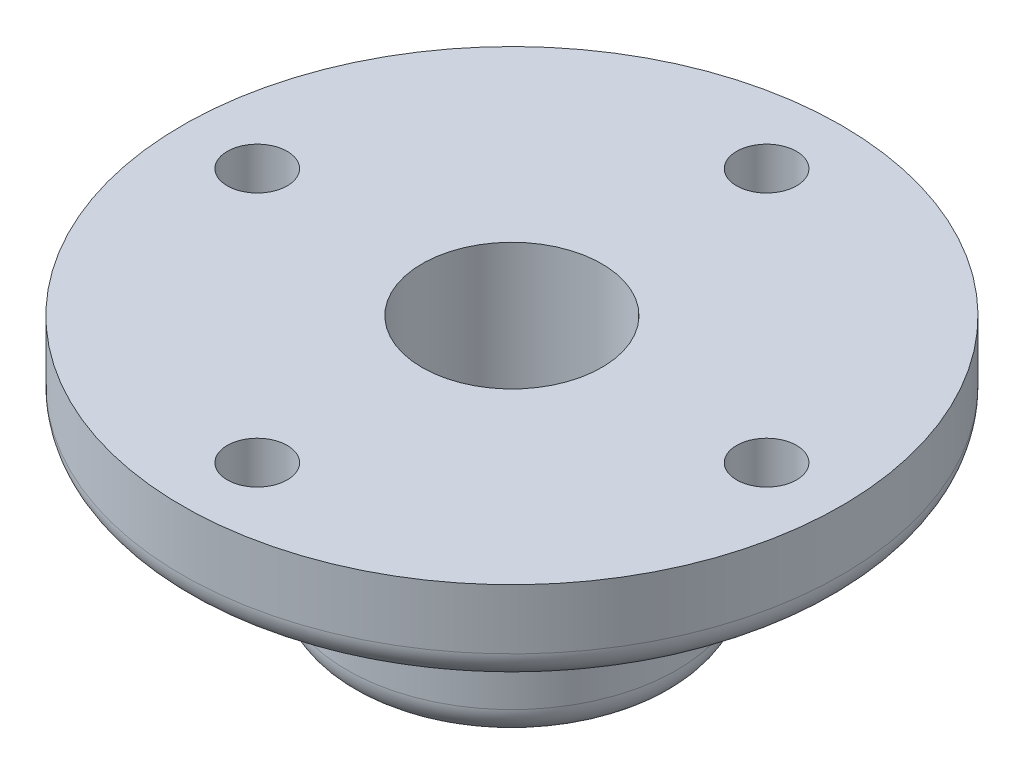
ISO-10303-21;
HEADER;
FILE_DESCRIPTION(('STEP AP214'),'2;1');
FILE_NAME('part.step','',(''),(''),'','','');
FILE_SCHEMA(('AUTOMOTIVE_DESIGN { 1 0 10303 214 1 1 1 1 }'));
ENDSEC;
DATA;
#1=APPLICATION_CONTEXT('core data for automotive mechanical design processes');
#2=APPLICATION_PROTOCOL_DEFINITION('international standard','automotive_design',2000,#1);
#3=PRODUCT_CONTEXT('',#1,'mechanical');
#4=PRODUCT('Part','Part','',(#3));
#5=PRODUCT_RELATED_PRODUCT_CATEGORY('part','',(#4));
#6=PRODUCT_DEFINITION_FORMATION('','',#4);
#7=PRODUCT_DEFINITION_CONTEXT('part definition',#1,'design');
#8=PRODUCT_DEFINITION('design','',#6,#7);
#9=PRODUCT_DEFINITION_SHAPE('','',#8);
#10=(LENGTH_UNIT() NAMED_UNIT(*) SI_UNIT(.MILLI.,.METRE.));
#11=(NAMED_UNIT(*) PLANE_ANGLE_UNIT() SI_UNIT($,.RADIAN.));
#12=(NAMED_UNIT(*) SI_UNIT($,.STERADIAN.) SOLID_ANGLE_UNIT());
#13=UNCERTAINTY_MEASURE_WITH_UNIT(LENGTH_MEASURE(1.E-05),#10,'distance_accuracy_value','');
#14=(GEOMETRIC_REPRESENTATION_CONTEXT(3) GLOBAL_UNCERTAINTY_ASSIGNED_CONTEXT((#13)) GLOBAL_UNIT_ASSIGNED_CONTEXT((#10,
#11,#12)) REPRESENTATION_CONTEXT('',''));
#15=CARTESIAN_POINT('',(0.,0.,0.));
#16=DIRECTION('',(0.,0.,1.));
#17=DIRECTION('',(1.,0.,0.));
#18=AXIS2_PLACEMENT_3D('',#15,#16,#17);
#19=CARTESIAN_POINT('',(0.,0.,0.));
#20=DIRECTION('',(0.,-1.,0.));
#21=DIRECTION('',(0.,0.,-1.));
#22=AXIS2_PLACEMENT_3D('',#19,#20,#21);
#23=CYLINDRICAL_SURFACE('',#22,34.925);
#24=CARTESIAN_POINT('',(0.,6.35000000000004,0.));
#25=DIRECTION('',(0.,-1.,0.));
#26=DIRECTION('',(0.,0.,-1.));
#27=AXIS2_PLACEMENT_3D('',#24,#25,#26);
#28=CIRCLE('',#27,34.925);
#29=CARTESIAN_POINT('',(0.,6.35000000000004,-34.925));
#30=VERTEX_POINT('',#29);
#31=EDGE_CURVE('E68',#30,#30,#28,.T.);
#32=ORIENTED_EDGE('',*,*,#31,.F.);
#33=EDGE_LOOP('',(#32));
#34=FACE_BOUND('',#33,.T.);
#35=CARTESIAN_POINT('',(0.,28.5749999999999,0.));
#36=DIRECTION('',(0.,-1.,0.));
#37=DIRECTION('',(0.,0.,-1.));
#38=AXIS2_PLACEMENT_3D('',#35,#36,#37);
#39=CIRCLE('',#38,34.925);
#40=CARTESIAN_POINT('',(0.,28.5749999999999,-34.925));
#41=VERTEX_POINT('',#40);
#42=EDGE_CURVE('E10',#41,#41,#39,.T.);
#43=ORIENTED_EDGE('',*,*,#42,.T.);
#44=EDGE_LOOP('',(#43));
#45=FACE_BOUND('',#44,.T.);
#46=ADVANCED_FACE('F37',(#34,#45),#23,.T.);
#47=CARTESIAN_POINT('',(0.,28.575,0.));
#48=DIRECTION('',(0.,-1.,0.));
#49=DIRECTION('',(0.,0.,-1.));
#50=AXIS2_PLACEMENT_3D('',#47,#48,#49);
#51=TOROIDAL_SURFACE('',#50,41.275,6.35);
#52=CARTESIAN_POINT('',(0.,34.925,0.));
#53=DIRECTION('',(0.,-1.,0.));
#54=DIRECTION('',(0.,0.,-1.));
#55=AXIS2_PLACEMENT_3D('',#52,#53,#54);
#56=CIRCLE('',#55,41.275);
#57=CARTESIAN_POINT('',(0.,34.925,-41.275));
#58=VERTEX_POINT('',#57);
#59=EDGE_CURVE('E44',#58,#58,#56,.T.);
#60=ORIENTED_EDGE('',*,*,#59,.T.);
#61=EDGE_LOOP('',(#60));
#62=FACE_BOUND('',#61,.T.);
#63=ORIENTED_EDGE('',*,*,#42,.F.);
#64=EDGE_LOOP('',(#63));
#65=FACE_BOUND('',#64,.T.);
#66=ADVANCED_FACE('F141',(#62,#65),#51,.F.);
#67=CARTESIAN_POINT('',(0.,34.925,0.));
#68=DIRECTION('',(0.,1.,0.));
#69=DIRECTION('',(0.,0.,1.));
#70=AXIS2_PLACEMENT_3D('',#67,#68,#69);
#71=PLANE('',#70);
#72=CARTESIAN_POINT('',(0.,34.925,-53.975));
#73=DIRECTION('',(0.,1.,0.));
#74=DIRECTION('',(0.,0.,1.));
#75=AXIS2_PLACEMENT_3D('',#72,#73,#74);
#76=CIRCLE('',#75,6.35);
#77=CARTESIAN_POINT('',(0.,34.925,-47.625));
#78=VERTEX_POINT('',#77);
#79=EDGE_CURVE('E72',#78,#78,#76,.T.);
#80=ORIENTED_EDGE('',*,*,#79,.T.);
#81=EDGE_LOOP('',(#80));
#82=FACE_BOUND('',#81,.T.);
#83=CARTESIAN_POINT('',(53.975,34.925,0.));
#84=DIRECTION('',(0.,1.,0.));
#85=DIRECTION('',(0.,0.,1.));
#86=AXIS2_PLACEMENT_3D('',#83,#84,#85);
#87=CIRCLE('',#86,6.35);
#88=CARTESIAN_POINT('',(53.975,34.925,6.35000000000001));
#89=VERTEX_POINT('',#88);
#90=EDGE_CURVE('E76',#89,#89,#87,.T.);
#91=ORIENTED_EDGE('',*,*,#90,.T.);
#92=EDGE_LOOP('',(#91));
#93=FACE_BOUND('',#92,.T.);
#94=CARTESIAN_POINT('',(0.,34.925,53.975));
#95=DIRECTION('',(0.,1.,0.));
#96=DIRECTION('',(0.,0.,1.));
#97=AXIS2_PLACEMENT_3D('',#94,#95,#96);
#98=CIRCLE('',#97,6.35);
#99=CARTESIAN_POINT('',(0.,34.925,60.325));
#100=VERTEX_POINT('',#99);
#101=EDGE_CURVE('E80',#100,#100,#98,.T.);
#102=ORIENTED_EDGE('',*,*,#101,.T.);
#103=EDGE_LOOP('',(#102));
#104=FACE_BOUND('',#103,.T.);
#105=CARTESIAN_POINT('',(-53.975,34.925,0.));
#106=DIRECTION('',(0.,1.,0.));
#107=DIRECTION('',(0.,0.,1.));
#108=AXIS2_PLACEMENT_3D('',#105,#106,#107);
#109=CIRCLE('',#108,6.34999999999956);
#110=CARTESIAN_POINT('',(-53.975,34.925,6.34999999999956));
#111=VERTEX_POINT('',#110);
#112=EDGE_CURVE('E84',#111,#111,#109,.T.);
#113=ORIENTED_EDGE('',*,*,#112,.T.);
#114=EDGE_LOOP('',(#113));
#115=FACE_BOUND('',#114,.T.);
#116=ORIENTED_EDGE('',*,*,#59,.F.);
#117=EDGE_LOOP('',(#116));
#118=FACE_BOUND('',#117,.T.);
#119=CARTESIAN_POINT('',(0.,34.925,0.));
#120=DIRECTION('',(0.,-1.,0.));
#121=DIRECTION('',(0.,0.,-1.));
#122=AXIS2_PLACEMENT_3D('',#119,#120,#121);
#123=CIRCLE('',#122,63.4999999999999);
#124=CARTESIAN_POINT('',(0.,34.925,-63.4999999999999));
#125=VERTEX_POINT('',#124);
#126=EDGE_CURVE('E49',#125,#125,#123,.T.);
#127=ORIENTED_EDGE('',*,*,#126,.T.);
#128=EDGE_LOOP('',(#127));
#129=FACE_BOUND('',#128,.T.);
#130=ADVANCED_FACE('F136',(#82,#93,#104,#115,#118,#129),#71,.F.);
#131=CARTESIAN_POINT('',(0.,41.275,0.));
#132=DIRECTION('',(0.,-1.,0.));
#133=DIRECTION('',(0.,0.,-1.));
#134=AXIS2_PLACEMENT_3D('',#131,#132,#133);
#135=TOROIDAL_SURFACE('',#134,63.5,6.34999999999999);
#136=ORIENTED_EDGE('',*,*,#126,.F.);
#137=EDGE_LOOP('',(#136));
#138=FACE_BOUND('',#137,.T.);
#139=CARTESIAN_POINT('',(0.,41.275,0.));
#140=DIRECTION('',(0.,-1.,0.));
#141=DIRECTION('',(0.,0.,-1.));
#142=AXIS2_PLACEMENT_3D('',#139,#140,#141);
#143=CIRCLE('',#142,69.85);
#144=CARTESIAN_POINT('',(0.,41.275,-69.85));
#145=VERTEX_POINT('',#144);
#146=EDGE_CURVE('E54',#145,#145,#143,.T.);
#147=ORIENTED_EDGE('',*,*,#146,.T.);
#148=EDGE_LOOP('',(#147));
#149=FACE_BOUND('',#148,.T.);
#150=ADVANCED_FACE('F130',(#138,#149),#135,.T.);
#151=CARTESIAN_POINT('',(0.,0.,0.));
#152=DIRECTION('',(0.,-1.,0.));
#153=DIRECTION('',(0.,0.,-1.));
#154=AXIS2_PLACEMENT_3D('',#151,#152,#153);
#155=CYLINDRICAL_SURFACE('',#154,69.85);
#156=ORIENTED_EDGE('',*,*,#146,.F.);
#157=EDGE_LOOP('',(#156));
#158=FACE_BOUND('',#157,.T.);
#159=CARTESIAN_POINT('',(0.,53.975,0.));
#160=DIRECTION('',(0.,-1.,0.));
#161=DIRECTION('',(0.,0.,-1.));
#162=AXIS2_PLACEMENT_3D('',#159,#160,#161);
#163=CIRCLE('',#162,69.85);
#164=CARTESIAN_POINT('',(0.,53.975,-69.85));
#165=VERTEX_POINT('',#164);
#166=EDGE_CURVE('E60',#165,#165,#163,.T.);
#167=ORIENTED_EDGE('',*,*,#166,.T.);
#168=EDGE_LOOP('',(#167));
#169=FACE_BOUND('',#168,.T.);
#170=ADVANCED_FACE('F120',(#158,#169),#155,.T.);
#171=CARTESIAN_POINT('',(0.,53.975,0.));
#172=DIRECTION('',(0.,-1.,0.));
#173=DIRECTION('',(0.,0.,-1.));
#174=AXIS2_PLACEMENT_3D('',#171,#172,#173);
#175=PLANE('',#174);
#176=CARTESIAN_POINT('',(0.,53.975,-53.975));
#177=DIRECTION('',(0.,1.,0.));
#178=DIRECTION('',(0.,0.,1.));
#179=AXIS2_PLACEMENT_3D('',#176,#177,#178);
#180=CIRCLE('',#179,6.35);
#181=CARTESIAN_POINT('',(0.,53.975,-47.625));
#182=VERTEX_POINT('',#181);
#183=EDGE_CURVE('E93',#182,#182,#180,.T.);
#184=ORIENTED_EDGE('',*,*,#183,.F.);
#185=EDGE_LOOP('',(#184));
#186=FACE_BOUND('',#185,.T.);
#187=CARTESIAN_POINT('',(53.975,53.975,0.));
#188=DIRECTION('',(0.,1.,0.));
#189=DIRECTION('',(0.,0.,1.));
#190=AXIS2_PLACEMENT_3D('',#187,#188,#189);
#191=CIRCLE('',#190,6.35);
#192=CARTESIAN_POINT('',(53.975,53.975,6.35000000000001));
#193=VERTEX_POINT('',#192);
#194=EDGE_CURVE('E97',#193,#193,#191,.T.);
#195=ORIENTED_EDGE('',*,*,#194,.F.);
#196=EDGE_LOOP('',(#195));
#197=FACE_BOUND('',#196,.T.);
#198=CARTESIAN_POINT('',(0.,53.975,53.975));
#199=DIRECTION('',(0.,1.,0.));
#200=DIRECTION('',(0.,0.,1.));
#201=AXIS2_PLACEMENT_3D('',#198,#199,#200);
#202=CIRCLE('',#201,6.35);
#203=CARTESIAN_POINT('',(0.,53.975,60.325));
#204=VERTEX_POINT('',#203);
#205=EDGE_CURVE('E101',#204,#204,#202,.T.);
#206=ORIENTED_EDGE('',*,*,#205,.F.);
#207=EDGE_LOOP('',(#206));
#208=FACE_BOUND('',#207,.T.);
#209=CARTESIAN_POINT('',(-53.975,53.975,0.));
#210=DIRECTION('',(0.,1.,0.));
#211=DIRECTION('',(0.,0.,1.));
#212=AXIS2_PLACEMENT_3D('',#209,#210,#211);
#213=CIRCLE('',#212,6.34999999999956);
#214=CARTESIAN_POINT('',(-53.975,53.975,6.34999999999956));
#215=VERTEX_POINT('',#214);
#216=EDGE_CURVE('E105',#215,#215,#213,.T.);
#217=ORIENTED_EDGE('',*,*,#216,.F.);
#218=EDGE_LOOP('',(#217));
#219=FACE_BOUND('',#218,.T.);
#220=CARTESIAN_POINT('',(0.,53.975,0.));
#221=DIRECTION('',(0.,1.,0.));
#222=DIRECTION('',(0.,0.,1.));
#223=AXIS2_PLACEMENT_3D('',#220,#221,#222);
#224=CIRCLE('',#223,19.05);
#225=CARTESIAN_POINT('',(0.,53.975,19.05));
#226=VERTEX_POINT('',#225);
#227=EDGE_CURVE('E89',#226,#226,#224,.T.);
#228=ORIENTED_EDGE('',*,*,#227,.F.);
#229=EDGE_LOOP('',(#228));
#230=FACE_BOUND('',#229,.T.);
#231=ORIENTED_EDGE('',*,*,#166,.F.);
#232=EDGE_LOOP('',(#231));
#233=FACE_BOUND('',#232,.T.);
#234=ADVANCED_FACE('F116',(#186,#197,#208,#219,#230,#233),#175,.F.);
#235=CARTESIAN_POINT('',(0.,0.,0.));
#236=DIRECTION('',(0.,1.,0.));
#237=DIRECTION('',(0.,0.,1.));
#238=AXIS2_PLACEMENT_3D('',#235,#236,#237);
#239=PLANE('',#238);
#240=CARTESIAN_POINT('',(0.,0.,0.));
#241=DIRECTION('',(0.,1.,0.));
#242=DIRECTION('',(0.,0.,1.));
#243=AXIS2_PLACEMENT_3D('',#240,#241,#242);
#244=CIRCLE('',#243,19.05);
#245=CARTESIAN_POINT('',(0.,0.,19.05));
#246=VERTEX_POINT('',#245);
#247=EDGE_CURVE('E88',#246,#246,#244,.T.);
#248=ORIENTED_EDGE('',*,*,#247,.T.);
#249=EDGE_LOOP('',(#248));
#250=FACE_BOUND('',#249,.T.);
#251=CARTESIAN_POINT('',(0.,0.,0.));
#252=DIRECTION('',(0.,-1.,0.));
#253=DIRECTION('',(0.,0.,-1.));
#254=AXIS2_PLACEMENT_3D('',#251,#252,#253);
#255=CIRCLE('',#254,28.575);
#256=CARTESIAN_POINT('',(0.,0.,-28.575));
#257=VERTEX_POINT('',#256);
#258=EDGE_CURVE('E64',#257,#257,#255,.T.);
#259=ORIENTED_EDGE('',*,*,#258,.T.);
#260=EDGE_LOOP('',(#259));
#261=FACE_BOUND('',#260,.T.);
#262=ADVANCED_FACE('F119',(#250,#261),#239,.F.);
#263=CARTESIAN_POINT('',(0.,6.35,0.));
#264=DIRECTION('',(0.,-1.,0.));
#265=DIRECTION('',(0.,0.,-1.));
#266=AXIS2_PLACEMENT_3D('',#263,#264,#265);
#267=TOROIDAL_SURFACE('',#266,28.575,6.35);
#268=ORIENTED_EDGE('',*,*,#31,.T.);
#269=EDGE_LOOP('',(#268));
#270=FACE_BOUND('',#269,.T.);
#271=ORIENTED_EDGE('',*,*,#258,.F.);
#272=EDGE_LOOP('',(#271));
#273=FACE_BOUND('',#272,.T.);
#274=ADVANCED_FACE('F148',(#270,#273),#267,.T.);
#275=CARTESIAN_POINT('',(0.,0.,0.));
#276=DIRECTION('',(0.,1.,0.));
#277=DIRECTION('',(0.,0.,1.));
#278=AXIS2_PLACEMENT_3D('',#275,#276,#277);
#279=CYLINDRICAL_SURFACE('',#278,19.05);
#280=ORIENTED_EDGE('',*,*,#247,.F.);
#281=EDGE_LOOP('',(#280));
#282=FACE_BOUND('',#281,.T.);
#283=ORIENTED_EDGE('',*,*,#227,.T.);
#284=EDGE_LOOP('',(#283));
#285=FACE_BOUND('',#284,.T.);
#286=ADVANCED_FACE('F151',(#282,#285),#279,.F.);
#287=CARTESIAN_POINT('',(-53.975,0.,0.));
#288=DIRECTION('',(0.,1.,0.));
#289=DIRECTION('',(0.,0.,1.));
#290=AXIS2_PLACEMENT_3D('',#287,#288,#289);
#291=CYLINDRICAL_SURFACE('',#290,6.34999999999956);
#292=ORIENTED_EDGE('',*,*,#216,.T.);
#293=EDGE_LOOP('',(#292));
#294=FACE_BOUND('',#293,.T.);
#295=ORIENTED_EDGE('',*,*,#112,.F.);
#296=EDGE_LOOP('',(#295));
#297=FACE_BOUND('',#296,.T.);
#298=ADVANCED_FACE('F163',(#294,#297),#291,.F.);
#299=CARTESIAN_POINT('',(0.,0.,53.975));
#300=DIRECTION('',(0.,1.,0.));
#301=DIRECTION('',(0.,0.,1.));
#302=AXIS2_PLACEMENT_3D('',#299,#300,#301);
#303=CYLINDRICAL_SURFACE('',#302,6.35);
#304=ORIENTED_EDGE('',*,*,#205,.T.);
#305=EDGE_LOOP('',(#304));
#306=FACE_BOUND('',#305,.T.);
#307=ORIENTED_EDGE('',*,*,#101,.F.);
#308=EDGE_LOOP('',(#307));
#309=FACE_BOUND('',#308,.T.);
#310=ADVANCED_FACE('F113',(#306,#309),#303,.F.);
#311=CARTESIAN_POINT('',(53.975,0.,0.));
#312=DIRECTION('',(0.,1.,0.));
#313=DIRECTION('',(0.,0.,1.));
#314=AXIS2_PLACEMENT_3D('',#311,#312,#313);
#315=CYLINDRICAL_SURFACE('',#314,6.35);
#316=ORIENTED_EDGE('',*,*,#194,.T.);
#317=EDGE_LOOP('',(#316));
#318=FACE_BOUND('',#317,.T.);
#319=ORIENTED_EDGE('',*,*,#90,.F.);
#320=EDGE_LOOP('',(#319));
#321=FACE_BOUND('',#320,.T.);
#322=ADVANCED_FACE('F165',(#318,#321),#315,.F.);
#323=CARTESIAN_POINT('',(0.,0.,-53.975));
#324=DIRECTION('',(0.,1.,0.));
#325=DIRECTION('',(0.,0.,1.));
#326=AXIS2_PLACEMENT_3D('',#323,#324,#325);
#327=CYLINDRICAL_SURFACE('',#326,6.35);
#328=ORIENTED_EDGE('',*,*,#183,.T.);
#329=EDGE_LOOP('',(#328));
#330=FACE_BOUND('',#329,.T.);
#331=ORIENTED_EDGE('',*,*,#79,.F.);
#332=EDGE_LOOP('',(#331));
#333=FACE_BOUND('',#332,.T.);
#334=ADVANCED_FACE('F168',(#330,#333),#327,.F.);
#335=CLOSED_SHELL('',(#46,#66,#130,#150,#170,#234,#262,#274,#286,#298,#310,#322,#334));
#336=MANIFOLD_SOLID_BREP('B2',#335);
#337=ADVANCED_BREP_SHAPE_REPRESENTATION('',(#18,#336),#14);
#338=SHAPE_DEFINITION_REPRESENTATION(#9,#337);
ENDSEC;
END-ISO-10303-21;
